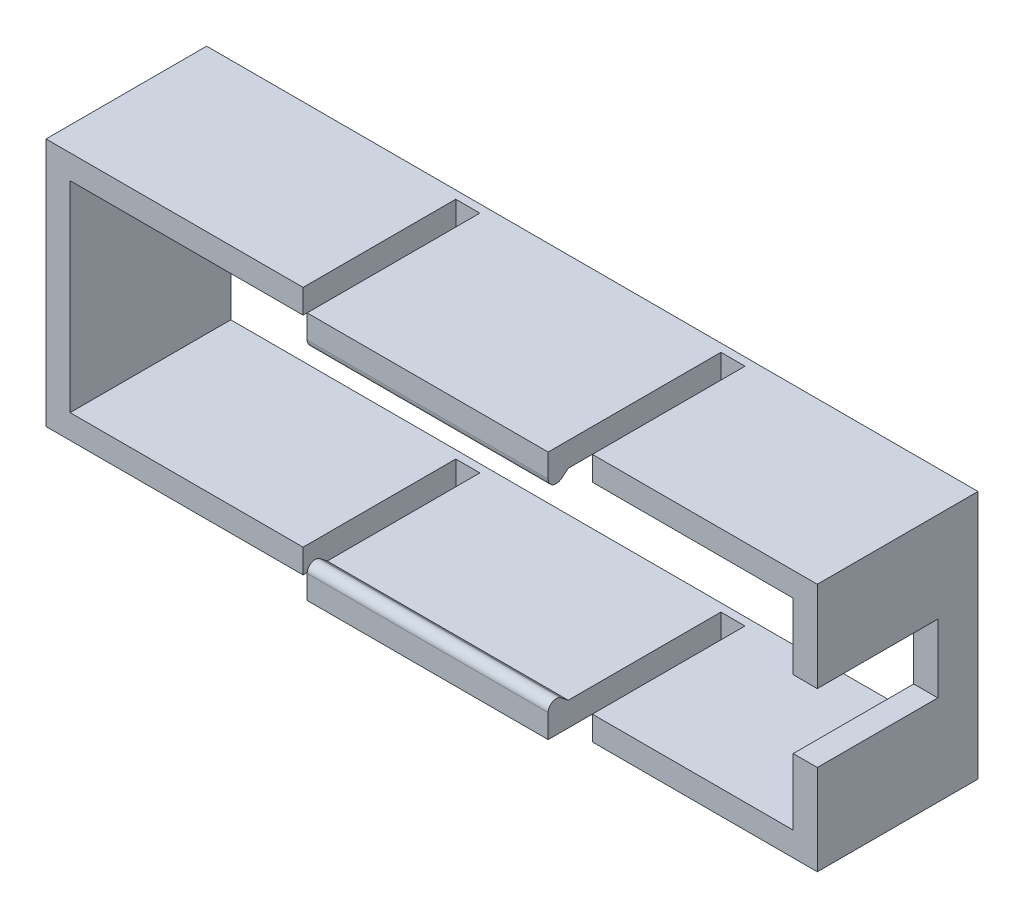
ISO-10303-21;
HEADER;
FILE_DESCRIPTION(('STEP AP214'),'2;1');
FILE_NAME('part.step','',(''),(''),'','','');
FILE_SCHEMA(('AUTOMOTIVE_DESIGN { 1 0 10303 214 1 1 1 1 }'));
ENDSEC;
DATA;
#1=APPLICATION_CONTEXT('core data for automotive mechanical design processes');
#2=APPLICATION_PROTOCOL_DEFINITION('international standard','automotive_design',2000,#1);
#3=PRODUCT_CONTEXT('',#1,'mechanical');
#4=PRODUCT('Part','Part','',(#3));
#5=PRODUCT_RELATED_PRODUCT_CATEGORY('part','',(#4));
#6=PRODUCT_DEFINITION_FORMATION('','',#4);
#7=PRODUCT_DEFINITION_CONTEXT('part definition',#1,'design');
#8=PRODUCT_DEFINITION('design','',#6,#7);
#9=PRODUCT_DEFINITION_SHAPE('','',#8);
#10=(LENGTH_UNIT() NAMED_UNIT(*) SI_UNIT(.MILLI.,.METRE.));
#11=(NAMED_UNIT(*) PLANE_ANGLE_UNIT() SI_UNIT($,.RADIAN.));
#12=(NAMED_UNIT(*) SI_UNIT($,.STERADIAN.) SOLID_ANGLE_UNIT());
#13=UNCERTAINTY_MEASURE_WITH_UNIT(LENGTH_MEASURE(1.E-05),#10,'distance_accuracy_value','');
#14=(GEOMETRIC_REPRESENTATION_CONTEXT(3) GLOBAL_UNCERTAINTY_ASSIGNED_CONTEXT((#13)) GLOBAL_UNIT_ASSIGNED_CONTEXT((#10,
#11,#12)) REPRESENTATION_CONTEXT('',''));
#15=CARTESIAN_POINT('',(0.,0.,0.));
#16=DIRECTION('',(0.,0.,1.));
#17=DIRECTION('',(1.,0.,0.));
#18=AXIS2_PLACEMENT_3D('',#15,#16,#17);
#19=CARTESIAN_POINT('',(0.,0.,20.));
#20=DIRECTION('',(0.,0.,1.));
#21=DIRECTION('',(1.,0.,0.));
#22=AXIS2_PLACEMENT_3D('',#19,#20,#21);
#23=PLANE('',#22);
#24=DIRECTION('',(0.,-1.,0.));
#25=VECTOR('',#24,1.);
#26=CARTESIAN_POINT('',(-16.,36.1234617712572,20.));
#27=LINE('',#26,#25);
#28=CARTESIAN_POINT('',(-16.,15.5,20.));
#29=VERTEX_POINT('',#28);
#30=CARTESIAN_POINT('',(-16.,12.5,20.));
#31=VERTEX_POINT('',#30);
#32=EDGE_CURVE('E336',#29,#31,#27,.T.);
#33=ORIENTED_EDGE('',*,*,#32,.F.);
#34=DIRECTION('',(-1.,0.,0.));
#35=VECTOR('',#34,1.);
#36=CARTESIAN_POINT('',(0.,15.5,20.));
#37=LINE('',#36,#35);
#38=CARTESIAN_POINT('',(-48.,15.5,20.));
#39=VERTEX_POINT('',#38);
#40=EDGE_CURVE('E495',#29,#39,#37,.T.);
#41=ORIENTED_EDGE('',*,*,#40,.T.);
#42=DIRECTION('',(0.,-1.,0.));
#43=VECTOR('',#42,1.);
#44=CARTESIAN_POINT('',(-48.,0.,20.));
#45=LINE('',#44,#43);
#46=CARTESIAN_POINT('',(-48.,-15.5,20.));
#47=VERTEX_POINT('',#46);
#48=EDGE_CURVE('E501',#39,#47,#45,.T.);
#49=ORIENTED_EDGE('',*,*,#48,.T.);
#50=DIRECTION('',(1.,0.,0.));
#51=VECTOR('',#50,1.);
#52=CARTESIAN_POINT('',(0.,-15.5,20.));
#53=LINE('',#52,#51);
#54=CARTESIAN_POINT('',(-16.,-15.5,20.));
#55=VERTEX_POINT('',#54);
#56=EDGE_CURVE('E505',#47,#55,#53,.T.);
#57=ORIENTED_EDGE('',*,*,#56,.T.);
#58=CARTESIAN_POINT('',(-16.,-12.5,20.));
#59=VERTEX_POINT('',#58);
#60=EDGE_CURVE('E342',#59,#55,#27,.T.);
#61=ORIENTED_EDGE('',*,*,#60,.F.);
#62=DIRECTION('',(1.,0.,0.));
#63=VECTOR('',#62,1.);
#64=CARTESIAN_POINT('',(-45.,-12.5,20.));
#65=LINE('',#64,#63);
#66=CARTESIAN_POINT('',(-45.,-12.5,20.));
#67=VERTEX_POINT('',#66);
#68=EDGE_CURVE('E456',#67,#59,#65,.T.);
#69=ORIENTED_EDGE('',*,*,#68,.F.);
#70=DIRECTION('',(0.,-1.,0.));
#71=VECTOR('',#70,1.);
#72=CARTESIAN_POINT('',(-45.,-12.5,20.));
#73=LINE('',#72,#71);
#74=CARTESIAN_POINT('',(-45.,12.5,20.));
#75=VERTEX_POINT('',#74);
#76=EDGE_CURVE('E450',#75,#67,#73,.T.);
#77=ORIENTED_EDGE('',*,*,#76,.F.);
#78=DIRECTION('',(-1.,0.,0.));
#79=VECTOR('',#78,1.);
#80=CARTESIAN_POINT('',(-45.,12.5,20.));
#81=LINE('',#80,#79);
#82=EDGE_CURVE('E444',#31,#75,#81,.T.);
#83=ORIENTED_EDGE('',*,*,#82,.F.);
#84=EDGE_LOOP('',(#33,#41,#49,#57,#61,#69,#77,#83));
#85=FACE_BOUND('',#84,.T.);
#86=ADVANCED_FACE('F65',(#85),#23,.T.);
#87=DIRECTION('',(0.,1.,0.));
#88=VECTOR('',#87,1.);
#89=CARTESIAN_POINT('',(20.,-29.0869382260208,20.));
#90=LINE('',#89,#88);
#91=CARTESIAN_POINT('',(20.,-15.5,20.));
#92=VERTEX_POINT('',#91);
#93=CARTESIAN_POINT('',(20.,-12.5,20.));
#94=VERTEX_POINT('',#93);
#95=EDGE_CURVE('E351',#92,#94,#90,.T.);
#96=ORIENTED_EDGE('',*,*,#95,.F.);
#97=CARTESIAN_POINT('',(48.,-15.5,20.));
#98=VERTEX_POINT('',#97);
#99=EDGE_CURVE('E504',#92,#98,#53,.T.);
#100=ORIENTED_EDGE('',*,*,#99,.T.);
#101=DIRECTION('',(0.,1.,0.));
#102=VECTOR('',#101,1.);
#103=CARTESIAN_POINT('',(48.,0.,20.));
#104=LINE('',#103,#102);
#105=CARTESIAN_POINT('',(48.,-4.25,20.));
#106=VERTEX_POINT('',#105);
#107=EDGE_CURVE('E491',#98,#106,#104,.T.);
#108=ORIENTED_EDGE('',*,*,#107,.T.);
#109=DIRECTION('',(1.,0.,0.));
#110=VECTOR('',#109,1.);
#111=CARTESIAN_POINT('',(23.5129949706792,-4.25,20.));
#112=LINE('',#111,#110);
#113=CARTESIAN_POINT('',(45.,-4.25,20.));
#114=VERTEX_POINT('',#113);
#115=EDGE_CURVE('E419',#114,#106,#112,.T.);
#116=ORIENTED_EDGE('',*,*,#115,.F.);
#117=DIRECTION('',(0.,1.,0.));
#118=VECTOR('',#117,1.);
#119=CARTESIAN_POINT('',(45.,-12.5,20.));
#120=LINE('',#119,#118);
#121=CARTESIAN_POINT('',(45.,-12.5,20.));
#122=VERTEX_POINT('',#121);
#123=EDGE_CURVE('E440',#122,#114,#120,.T.);
#124=ORIENTED_EDGE('',*,*,#123,.F.);
#125=EDGE_CURVE('E455',#94,#122,#65,.T.);
#126=ORIENTED_EDGE('',*,*,#125,.F.);
#127=EDGE_LOOP('',(#96,#100,#108,#116,#124,#126));
#128=FACE_BOUND('',#127,.T.);
#129=ADVANCED_FACE('F615',(#128),#23,.T.);
#130=CARTESIAN_POINT('',(20.,12.5,20.));
#131=VERTEX_POINT('',#130);
#132=CARTESIAN_POINT('',(20.,15.5,20.));
#133=VERTEX_POINT('',#132);
#134=EDGE_CURVE('E330',#131,#133,#90,.T.);
#135=ORIENTED_EDGE('',*,*,#134,.F.);
#136=CARTESIAN_POINT('',(45.,12.5,20.));
#137=VERTEX_POINT('',#136);
#138=EDGE_CURVE('E446',#137,#131,#81,.T.);
#139=ORIENTED_EDGE('',*,*,#138,.F.);
#140=CARTESIAN_POINT('',(45.,4.25,20.));
#141=VERTEX_POINT('',#140);
#142=EDGE_CURVE('E445',#141,#137,#120,.T.);
#143=ORIENTED_EDGE('',*,*,#142,.F.);
#144=DIRECTION('',(-1.,0.,0.));
#145=VECTOR('',#144,1.);
#146=CARTESIAN_POINT('',(23.5129949706792,4.25,20.));
#147=LINE('',#146,#145);
#148=CARTESIAN_POINT('',(48.,4.25,20.));
#149=VERTEX_POINT('',#148);
#150=EDGE_CURVE('E414',#149,#141,#147,.T.);
#151=ORIENTED_EDGE('',*,*,#150,.F.);
#152=CARTESIAN_POINT('',(48.,15.5,20.));
#153=VERTEX_POINT('',#152);
#154=EDGE_CURVE('E496',#149,#153,#104,.T.);
#155=ORIENTED_EDGE('',*,*,#154,.T.);
#156=EDGE_CURVE('E497',#153,#133,#37,.T.);
#157=ORIENTED_EDGE('',*,*,#156,.T.);
#158=EDGE_LOOP('',(#135,#139,#143,#151,#155,#157));
#159=FACE_BOUND('',#158,.T.);
#160=ADVANCED_FACE('F653',(#159),#23,.T.);
#161=CARTESIAN_POINT('',(0.,0.,0.));
#162=DIRECTION('',(0.,0.,1.));
#163=DIRECTION('',(1.,0.,0.));
#164=AXIS2_PLACEMENT_3D('',#161,#162,#163);
#165=PLANE('',#164);
#166=DIRECTION('',(0.,1.,0.));
#167=VECTOR('',#166,1.);
#168=CARTESIAN_POINT('',(48.,0.,0.));
#169=LINE('',#168,#167);
#170=CARTESIAN_POINT('',(48.,-15.5,0.));
#171=VERTEX_POINT('',#170);
#172=CARTESIAN_POINT('',(48.,15.5,0.));
#173=VERTEX_POINT('',#172);
#174=EDGE_CURVE('E490',#171,#173,#169,.T.);
#175=ORIENTED_EDGE('',*,*,#174,.F.);
#176=DIRECTION('',(1.,0.,0.));
#177=VECTOR('',#176,1.);
#178=CARTESIAN_POINT('',(0.,-15.5,0.));
#179=LINE('',#178,#177);
#180=CARTESIAN_POINT('',(-48.,-15.5,0.));
#181=VERTEX_POINT('',#180);
#182=EDGE_CURVE('E519',#181,#171,#179,.T.);
#183=ORIENTED_EDGE('',*,*,#182,.F.);
#184=DIRECTION('',(0.,-1.,0.));
#185=VECTOR('',#184,1.);
#186=CARTESIAN_POINT('',(-48.,0.,0.));
#187=LINE('',#186,#185);
#188=CARTESIAN_POINT('',(-48.,15.5,0.));
#189=VERTEX_POINT('',#188);
#190=EDGE_CURVE('E516',#189,#181,#187,.T.);
#191=ORIENTED_EDGE('',*,*,#190,.F.);
#192=DIRECTION('',(-1.,0.,0.));
#193=VECTOR('',#192,1.);
#194=CARTESIAN_POINT('',(0.,15.5,0.));
#195=LINE('',#194,#193);
#196=EDGE_CURVE('E513',#173,#189,#195,.T.);
#197=ORIENTED_EDGE('',*,*,#196,.F.);
#198=EDGE_LOOP('',(#175,#183,#191,#197));
#199=FACE_BOUND('',#198,.T.);
#200=DIRECTION('',(0.,1.,0.));
#201=VECTOR('',#200,1.);
#202=CARTESIAN_POINT('',(45.,-12.5,0.));
#203=LINE('',#202,#201);
#204=CARTESIAN_POINT('',(45.,-12.5,0.));
#205=VERTEX_POINT('',#204);
#206=CARTESIAN_POINT('',(45.,12.5,0.));
#207=VERTEX_POINT('',#206);
#208=EDGE_CURVE('E439',#205,#207,#203,.T.);
#209=ORIENTED_EDGE('',*,*,#208,.T.);
#210=DIRECTION('',(-1.,0.,0.));
#211=VECTOR('',#210,1.);
#212=CARTESIAN_POINT('',(-45.,12.5,0.));
#213=LINE('',#212,#211);
#214=CARTESIAN_POINT('',(-45.,12.5,0.));
#215=VERTEX_POINT('',#214);
#216=EDGE_CURVE('E465',#207,#215,#213,.T.);
#217=ORIENTED_EDGE('',*,*,#216,.T.);
#218=DIRECTION('',(0.,-1.,0.));
#219=VECTOR('',#218,1.);
#220=CARTESIAN_POINT('',(-45.,-12.5,0.));
#221=LINE('',#220,#219);
#222=CARTESIAN_POINT('',(-45.,-12.5,0.));
#223=VERTEX_POINT('',#222);
#224=EDGE_CURVE('E469',#215,#223,#221,.T.);
#225=ORIENTED_EDGE('',*,*,#224,.T.);
#226=DIRECTION('',(1.,0.,0.));
#227=VECTOR('',#226,1.);
#228=CARTESIAN_POINT('',(-45.,-12.5,0.));
#229=LINE('',#228,#227);
#230=EDGE_CURVE('E473',#223,#205,#229,.T.);
#231=ORIENTED_EDGE('',*,*,#230,.T.);
#232=EDGE_LOOP('',(#209,#217,#225,#231));
#233=FACE_BOUND('',#232,.T.);
#234=ADVANCED_FACE('F623',(#199,#233),#165,.F.);
#235=CARTESIAN_POINT('',(48.,0.,20.));
#236=DIRECTION('',(-1.,0.,0.));
#237=DIRECTION('',(0.,0.,1.));
#238=AXIS2_PLACEMENT_3D('',#235,#236,#237);
#239=PLANE('',#238);
#240=DIRECTION('',(0.,-1.,0.));
#241=VECTOR('',#240,1.);
#242=CARTESIAN_POINT('',(48.,0.,5.));
#243=LINE('',#242,#241);
#244=CARTESIAN_POINT('',(48.,4.25,5.));
#245=VERTEX_POINT('',#244);
#246=CARTESIAN_POINT('',(48.,-4.25,5.));
#247=VERTEX_POINT('',#246);
#248=EDGE_CURVE('E423',#245,#247,#243,.T.);
#249=ORIENTED_EDGE('',*,*,#248,.T.);
#250=DIRECTION('',(0.,0.,1.));
#251=VECTOR('',#250,1.);
#252=CARTESIAN_POINT('',(48.,-4.25,20.));
#253=LINE('',#252,#251);
#254=EDGE_CURVE('E435',#247,#106,#253,.T.);
#255=ORIENTED_EDGE('',*,*,#254,.T.);
#256=ORIENTED_EDGE('',*,*,#107,.F.);
#257=DIRECTION('',(0.,0.,-1.));
#258=VECTOR('',#257,1.);
#259=CARTESIAN_POINT('',(48.,-15.5,20.));
#260=LINE('',#259,#258);
#261=EDGE_CURVE('E509',#98,#171,#260,.T.);
#262=ORIENTED_EDGE('',*,*,#261,.T.);
#263=ORIENTED_EDGE('',*,*,#174,.T.);
#264=DIRECTION('',(0.,0.,-1.));
#265=VECTOR('',#264,1.);
#266=CARTESIAN_POINT('',(48.,15.5,20.));
#267=LINE('',#266,#265);
#268=EDGE_CURVE('E533',#153,#173,#267,.T.);
#269=ORIENTED_EDGE('',*,*,#268,.F.);
#270=ORIENTED_EDGE('',*,*,#154,.F.);
#271=DIRECTION('',(0.,0.,-1.));
#272=VECTOR('',#271,1.);
#273=CARTESIAN_POINT('',(48.,4.25,20.));
#274=LINE('',#273,#272);
#275=EDGE_CURVE('E431',#149,#245,#274,.T.);
#276=ORIENTED_EDGE('',*,*,#275,.T.);
#277=EDGE_LOOP('',(#249,#255,#256,#262,#263,#269,#270,#276));
#278=FACE_BOUND('',#277,.T.);
#279=ADVANCED_FACE('F664',(#278),#239,.F.);
#280=CARTESIAN_POINT('',(0.,15.5,20.));
#281=DIRECTION('',(0.,-1.,0.));
#282=DIRECTION('',(0.,0.,-1.));
#283=AXIS2_PLACEMENT_3D('',#280,#281,#282);
#284=PLANE('',#283);
#285=ORIENTED_EDGE('',*,*,#40,.F.);
#286=DIRECTION('',(0.,0.,-1.));
#287=VECTOR('',#286,1.);
#288=CARTESIAN_POINT('',(-16.,15.5,20.));
#289=LINE('',#288,#287);
#290=CARTESIAN_POINT('',(-16.,15.5,1.));
#291=VERTEX_POINT('',#290);
#292=EDGE_CURVE('E410',#29,#291,#289,.T.);
#293=ORIENTED_EDGE('',*,*,#292,.T.);
#294=DIRECTION('',(1.,0.,0.));
#295=VECTOR('',#294,1.);
#296=CARTESIAN_POINT('',(0.,15.5,1.));
#297=LINE('',#296,#295);
#298=CARTESIAN_POINT('',(-13.,15.5,1.));
#299=VERTEX_POINT('',#298);
#300=EDGE_CURVE('E388',#291,#299,#297,.T.);
#301=ORIENTED_EDGE('',*,*,#300,.T.);
#302=DIRECTION('',(0.,0.,-1.));
#303=VECTOR('',#302,1.);
#304=CARTESIAN_POINT('',(-13.,15.5,20.));
#305=LINE('',#304,#303);
#306=CARTESIAN_POINT('',(-13.,15.5,22.5));
#307=VERTEX_POINT('',#306);
#308=EDGE_CURVE('E399',#307,#299,#305,.T.);
#309=ORIENTED_EDGE('',*,*,#308,.F.);
#310=DIRECTION('',(-1.,0.,0.));
#311=VECTOR('',#310,1.);
#312=CARTESIAN_POINT('',(22.5901699437495,15.5,22.5));
#313=LINE('',#312,#311);
#314=CARTESIAN_POINT('',(17.,15.5,22.5));
#315=VERTEX_POINT('',#314);
#316=EDGE_CURVE('E326',#315,#307,#313,.T.);
#317=ORIENTED_EDGE('',*,*,#316,.F.);
#318=DIRECTION('',(0.,0.,1.));
#319=VECTOR('',#318,1.);
#320=CARTESIAN_POINT('',(17.,15.5,20.));
#321=LINE('',#320,#319);
#322=CARTESIAN_POINT('',(17.,15.5,1.));
#323=VERTEX_POINT('',#322);
#324=EDGE_CURVE('E299',#323,#315,#321,.T.);
#325=ORIENTED_EDGE('',*,*,#324,.F.);
#326=DIRECTION('',(1.,0.,0.));
#327=VECTOR('',#326,1.);
#328=CARTESIAN_POINT('',(0.,15.5,1.));
#329=LINE('',#328,#327);
#330=CARTESIAN_POINT('',(20.,15.5,1.));
#331=VERTEX_POINT('',#330);
#332=EDGE_CURVE('E363',#323,#331,#329,.T.);
#333=ORIENTED_EDGE('',*,*,#332,.T.);
#334=DIRECTION('',(0.,0.,1.));
#335=VECTOR('',#334,1.);
#336=CARTESIAN_POINT('',(20.,15.5,20.));
#337=LINE('',#336,#335);
#338=EDGE_CURVE('E378',#331,#133,#337,.T.);
#339=ORIENTED_EDGE('',*,*,#338,.T.);
#340=ORIENTED_EDGE('',*,*,#156,.F.);
#341=ORIENTED_EDGE('',*,*,#268,.T.);
#342=ORIENTED_EDGE('',*,*,#196,.T.);
#343=DIRECTION('',(0.,0.,-1.));
#344=VECTOR('',#343,1.);
#345=CARTESIAN_POINT('',(-48.,15.5,20.));
#346=LINE('',#345,#344);
#347=EDGE_CURVE('E529',#39,#189,#346,.T.);
#348=ORIENTED_EDGE('',*,*,#347,.F.);
#349=EDGE_LOOP('',(#285,#293,#301,#309,#317,#325,#333,#339,#340,#341,#342,#348));
#350=FACE_BOUND('',#349,.T.);
#351=ADVANCED_FACE('F686',(#350),#284,.F.);
#352=CARTESIAN_POINT('',(-48.,0.,20.));
#353=DIRECTION('',(1.,0.,0.));
#354=DIRECTION('',(0.,0.,-1.));
#355=AXIS2_PLACEMENT_3D('',#352,#353,#354);
#356=PLANE('',#355);
#357=ORIENTED_EDGE('',*,*,#190,.T.);
#358=DIRECTION('',(0.,0.,-1.));
#359=VECTOR('',#358,1.);
#360=CARTESIAN_POINT('',(-48.,-15.5,20.));
#361=LINE('',#360,#359);
#362=EDGE_CURVE('E525',#47,#181,#361,.T.);
#363=ORIENTED_EDGE('',*,*,#362,.F.);
#364=ORIENTED_EDGE('',*,*,#48,.F.);
#365=ORIENTED_EDGE('',*,*,#347,.T.);
#366=EDGE_LOOP('',(#357,#363,#364,#365));
#367=FACE_BOUND('',#366,.T.);
#368=ADVANCED_FACE('F719',(#367),#356,.F.);
#369=CARTESIAN_POINT('',(0.,-15.5,20.));
#370=DIRECTION('',(0.,1.,0.));
#371=DIRECTION('',(0.,0.,1.));
#372=AXIS2_PLACEMENT_3D('',#369,#370,#371);
#373=PLANE('',#372);
#374=DIRECTION('',(-1.,0.,0.));
#375=VECTOR('',#374,1.);
#376=CARTESIAN_POINT('',(0.,-15.5,1.));
#377=LINE('',#376,#375);
#378=CARTESIAN_POINT('',(-13.,-15.5,1.));
#379=VERTEX_POINT('',#378);
#380=CARTESIAN_POINT('',(-16.,-15.5,1.));
#381=VERTEX_POINT('',#380);
#382=EDGE_CURVE('E385',#379,#381,#377,.T.);
#383=ORIENTED_EDGE('',*,*,#382,.T.);
#384=DIRECTION('',(0.,0.,1.));
#385=VECTOR('',#384,1.);
#386=CARTESIAN_POINT('',(-16.,-15.5,20.));
#387=LINE('',#386,#385);
#388=EDGE_CURVE('E406',#381,#55,#387,.T.);
#389=ORIENTED_EDGE('',*,*,#388,.T.);
#390=ORIENTED_EDGE('',*,*,#56,.F.);
#391=ORIENTED_EDGE('',*,*,#362,.T.);
#392=ORIENTED_EDGE('',*,*,#182,.T.);
#393=ORIENTED_EDGE('',*,*,#261,.F.);
#394=ORIENTED_EDGE('',*,*,#99,.F.);
#395=DIRECTION('',(0.,0.,-1.));
#396=VECTOR('',#395,1.);
#397=CARTESIAN_POINT('',(20.,-15.5,20.));
#398=LINE('',#397,#396);
#399=CARTESIAN_POINT('',(20.,-15.5,1.));
#400=VERTEX_POINT('',#399);
#401=EDGE_CURVE('E375',#92,#400,#398,.T.);
#402=ORIENTED_EDGE('',*,*,#401,.T.);
#403=DIRECTION('',(-1.,0.,0.));
#404=VECTOR('',#403,1.);
#405=CARTESIAN_POINT('',(0.,-15.5,1.));
#406=LINE('',#405,#404);
#407=CARTESIAN_POINT('',(17.,-15.5,1.));
#408=VERTEX_POINT('',#407);
#409=EDGE_CURVE('E297',#400,#408,#406,.T.);
#410=ORIENTED_EDGE('',*,*,#409,.T.);
#411=DIRECTION('',(0.,0.,-1.));
#412=VECTOR('',#411,1.);
#413=CARTESIAN_POINT('',(17.,-15.5,20.));
#414=LINE('',#413,#412);
#415=CARTESIAN_POINT('',(17.,-15.5,22.5));
#416=VERTEX_POINT('',#415);
#417=EDGE_CURVE('E278',#416,#408,#414,.T.);
#418=ORIENTED_EDGE('',*,*,#417,.F.);
#419=DIRECTION('',(-1.,0.,0.));
#420=VECTOR('',#419,1.);
#421=CARTESIAN_POINT('',(22.5901699437495,-15.5,22.5));
#422=LINE('',#421,#420);
#423=CARTESIAN_POINT('',(-13.,-15.5,22.5));
#424=VERTEX_POINT('',#423);
#425=EDGE_CURVE('E295',#416,#424,#422,.T.);
#426=ORIENTED_EDGE('',*,*,#425,.T.);
#427=DIRECTION('',(0.,0.,1.));
#428=VECTOR('',#427,1.);
#429=CARTESIAN_POINT('',(-13.,-15.5,20.));
#430=LINE('',#429,#428);
#431=EDGE_CURVE('E396',#379,#424,#430,.T.);
#432=ORIENTED_EDGE('',*,*,#431,.F.);
#433=EDGE_LOOP('',(#383,#389,#390,#391,#392,#393,#394,#402,#410,#418,#426,#432));
#434=FACE_BOUND('',#433,.T.);
#435=ADVANCED_FACE('F293',(#434),#373,.F.);
#436=CARTESIAN_POINT('',(45.,-12.5,20.));
#437=DIRECTION('',(-1.,0.,0.));
#438=DIRECTION('',(0.,0.,1.));
#439=AXIS2_PLACEMENT_3D('',#436,#437,#438);
#440=PLANE('',#439);
#441=DIRECTION('',(0.,0.,1.));
#442=VECTOR('',#441,1.);
#443=CARTESIAN_POINT('',(45.,-4.25,20.));
#444=LINE('',#443,#442);
#445=CARTESIAN_POINT('',(45.,-4.25,5.));
#446=VERTEX_POINT('',#445);
#447=EDGE_CURVE('E544',#446,#114,#444,.T.);
#448=ORIENTED_EDGE('',*,*,#447,.F.);
#449=DIRECTION('',(0.,-1.,0.));
#450=VECTOR('',#449,1.);
#451=CARTESIAN_POINT('',(45.,-12.5,5.));
#452=LINE('',#451,#450);
#453=CARTESIAN_POINT('',(45.,4.25,5.));
#454=VERTEX_POINT('',#453);
#455=EDGE_CURVE('E537',#454,#446,#452,.T.);
#456=ORIENTED_EDGE('',*,*,#455,.F.);
#457=DIRECTION('',(0.,0.,-1.));
#458=VECTOR('',#457,1.);
#459=CARTESIAN_POINT('',(45.,4.25,20.));
#460=LINE('',#459,#458);
#461=EDGE_CURVE('E540',#141,#454,#460,.T.);
#462=ORIENTED_EDGE('',*,*,#461,.F.);
#463=ORIENTED_EDGE('',*,*,#142,.T.);
#464=DIRECTION('',(0.,0.,-1.));
#465=VECTOR('',#464,1.);
#466=CARTESIAN_POINT('',(45.,12.5,20.));
#467=LINE('',#466,#465);
#468=EDGE_CURVE('E486',#137,#207,#467,.T.);
#469=ORIENTED_EDGE('',*,*,#468,.T.);
#470=ORIENTED_EDGE('',*,*,#208,.F.);
#471=DIRECTION('',(0.,0.,-1.));
#472=VECTOR('',#471,1.);
#473=CARTESIAN_POINT('',(45.,-12.5,20.));
#474=LINE('',#473,#472);
#475=EDGE_CURVE('E460',#122,#205,#474,.T.);
#476=ORIENTED_EDGE('',*,*,#475,.F.);
#477=ORIENTED_EDGE('',*,*,#123,.T.);
#478=EDGE_LOOP('',(#448,#456,#462,#463,#469,#470,#476,#477));
#479=FACE_BOUND('',#478,.T.);
#480=ADVANCED_FACE('F619',(#479),#440,.T.);
#481=CARTESIAN_POINT('',(-45.,12.5,20.));
#482=DIRECTION('',(0.,-1.,0.));
#483=DIRECTION('',(0.,0.,-1.));
#484=AXIS2_PLACEMENT_3D('',#481,#482,#483);
#485=PLANE('',#484);
#486=DIRECTION('',(0.,0.,-1.));
#487=VECTOR('',#486,1.);
#488=CARTESIAN_POINT('',(-16.,12.5,20.));
#489=LINE('',#488,#487);
#490=CARTESIAN_POINT('',(-16.,12.5,1.));
#491=VERTEX_POINT('',#490);
#492=EDGE_CURVE('E402',#31,#491,#489,.T.);
#493=ORIENTED_EDGE('',*,*,#492,.F.);
#494=ORIENTED_EDGE('',*,*,#82,.T.);
#495=DIRECTION('',(0.,0.,-1.));
#496=VECTOR('',#495,1.);
#497=CARTESIAN_POINT('',(-45.,12.5,20.));
#498=LINE('',#497,#496);
#499=EDGE_CURVE('E483',#75,#215,#498,.T.);
#500=ORIENTED_EDGE('',*,*,#499,.T.);
#501=ORIENTED_EDGE('',*,*,#216,.F.);
#502=ORIENTED_EDGE('',*,*,#468,.F.);
#503=ORIENTED_EDGE('',*,*,#138,.T.);
#504=DIRECTION('',(0.,0.,1.));
#505=VECTOR('',#504,1.);
#506=CARTESIAN_POINT('',(20.,12.5,20.));
#507=LINE('',#506,#505);
#508=CARTESIAN_POINT('',(20.,12.5,1.));
#509=VERTEX_POINT('',#508);
#510=EDGE_CURVE('E372',#509,#131,#507,.T.);
#511=ORIENTED_EDGE('',*,*,#510,.F.);
#512=DIRECTION('',(1.,0.,0.));
#513=VECTOR('',#512,1.);
#514=CARTESIAN_POINT('',(-45.,12.5,1.));
#515=LINE('',#514,#513);
#516=CARTESIAN_POINT('',(17.,12.5,1.));
#517=VERTEX_POINT('',#516);
#518=EDGE_CURVE('E358',#517,#509,#515,.T.);
#519=ORIENTED_EDGE('',*,*,#518,.F.);
#520=DIRECTION('',(0.,0.,1.));
#521=VECTOR('',#520,1.);
#522=CARTESIAN_POINT('',(17.,12.5,20.));
#523=LINE('',#522,#521);
#524=CARTESIAN_POINT('',(17.,12.5,20.));
#525=VERTEX_POINT('',#524);
#526=EDGE_CURVE('E300',#517,#525,#523,.T.);
#527=ORIENTED_EDGE('',*,*,#526,.T.);
#528=CARTESIAN_POINT('',(-13.,12.5,20.));
#529=VERTEX_POINT('',#528);
#530=EDGE_CURVE('E451',#525,#529,#81,.T.);
#531=ORIENTED_EDGE('',*,*,#530,.T.);
#532=DIRECTION('',(0.,0.,-1.));
#533=VECTOR('',#532,1.);
#534=CARTESIAN_POINT('',(-13.,12.5,20.));
#535=LINE('',#534,#533);
#536=CARTESIAN_POINT('',(-13.,12.5,1.));
#537=VERTEX_POINT('',#536);
#538=EDGE_CURVE('E392',#529,#537,#535,.T.);
#539=ORIENTED_EDGE('',*,*,#538,.T.);
#540=DIRECTION('',(1.,0.,0.));
#541=VECTOR('',#540,1.);
#542=CARTESIAN_POINT('',(-45.,12.5,1.));
#543=LINE('',#542,#541);
#544=EDGE_CURVE('E382',#491,#537,#543,.T.);
#545=ORIENTED_EDGE('',*,*,#544,.F.);
#546=EDGE_LOOP('',(#493,#494,#500,#501,#502,#503,#511,#519,#527,#531,#539,#545));
#547=FACE_BOUND('',#546,.T.);
#548=ADVANCED_FACE('F675',(#547),#485,.T.);
#549=CARTESIAN_POINT('',(-45.,-12.5,20.));
#550=DIRECTION('',(1.,0.,0.));
#551=DIRECTION('',(0.,0.,-1.));
#552=AXIS2_PLACEMENT_3D('',#549,#550,#551);
#553=PLANE('',#552);
#554=ORIENTED_EDGE('',*,*,#224,.F.);
#555=ORIENTED_EDGE('',*,*,#499,.F.);
#556=ORIENTED_EDGE('',*,*,#76,.T.);
#557=DIRECTION('',(0.,0.,-1.));
#558=VECTOR('',#557,1.);
#559=CARTESIAN_POINT('',(-45.,-12.5,20.));
#560=LINE('',#559,#558);
#561=EDGE_CURVE('E480',#67,#223,#560,.T.);
#562=ORIENTED_EDGE('',*,*,#561,.T.);
#563=EDGE_LOOP('',(#554,#555,#556,#562));
#564=FACE_BOUND('',#563,.T.);
#565=ADVANCED_FACE('F627',(#564),#553,.T.);
#566=CARTESIAN_POINT('',(-45.,-12.5,20.));
#567=DIRECTION('',(0.,1.,0.));
#568=DIRECTION('',(0.,0.,1.));
#569=AXIS2_PLACEMENT_3D('',#566,#567,#568);
#570=PLANE('',#569);
#571=DIRECTION('',(0.,0.,1.));
#572=VECTOR('',#571,1.);
#573=CARTESIAN_POINT('',(-16.,-12.5,20.));
#574=LINE('',#573,#572);
#575=CARTESIAN_POINT('',(-16.,-12.5,1.));
#576=VERTEX_POINT('',#575);
#577=EDGE_CURVE('E564',#576,#59,#574,.T.);
#578=ORIENTED_EDGE('',*,*,#577,.F.);
#579=DIRECTION('',(-1.,0.,0.));
#580=VECTOR('',#579,1.);
#581=CARTESIAN_POINT('',(-45.,-12.5,1.));
#582=LINE('',#581,#580);
#583=CARTESIAN_POINT('',(-13.,-12.5,1.));
#584=VERTEX_POINT('',#583);
#585=EDGE_CURVE('E558',#584,#576,#582,.T.);
#586=ORIENTED_EDGE('',*,*,#585,.F.);
#587=DIRECTION('',(0.,0.,1.));
#588=VECTOR('',#587,1.);
#589=CARTESIAN_POINT('',(-13.,-12.5,20.));
#590=LINE('',#589,#588);
#591=CARTESIAN_POINT('',(-13.,-12.5,20.));
#592=VERTEX_POINT('',#591);
#593=EDGE_CURVE('E561',#584,#592,#590,.T.);
#594=ORIENTED_EDGE('',*,*,#593,.T.);
#595=CARTESIAN_POINT('',(17.,-12.5,20.));
#596=VERTEX_POINT('',#595);
#597=EDGE_CURVE('E461',#592,#596,#65,.T.);
#598=ORIENTED_EDGE('',*,*,#597,.T.);
#599=DIRECTION('',(0.,0.,-1.));
#600=VECTOR('',#599,1.);
#601=CARTESIAN_POINT('',(17.,-12.5,20.));
#602=LINE('',#601,#600);
#603=CARTESIAN_POINT('',(17.,-12.5,1.));
#604=VERTEX_POINT('',#603);
#605=EDGE_CURVE('E550',#596,#604,#602,.T.);
#606=ORIENTED_EDGE('',*,*,#605,.T.);
#607=DIRECTION('',(-1.,0.,0.));
#608=VECTOR('',#607,1.);
#609=CARTESIAN_POINT('',(-45.,-12.5,1.));
#610=LINE('',#609,#608);
#611=CARTESIAN_POINT('',(20.,-12.5,1.));
#612=VERTEX_POINT('',#611);
#613=EDGE_CURVE('E547',#612,#604,#610,.T.);
#614=ORIENTED_EDGE('',*,*,#613,.F.);
#615=DIRECTION('',(0.,0.,-1.));
#616=VECTOR('',#615,1.);
#617=CARTESIAN_POINT('',(20.,-12.5,20.));
#618=LINE('',#617,#616);
#619=EDGE_CURVE('E554',#94,#612,#618,.T.);
#620=ORIENTED_EDGE('',*,*,#619,.F.);
#621=ORIENTED_EDGE('',*,*,#125,.T.);
#622=ORIENTED_EDGE('',*,*,#475,.T.);
#623=ORIENTED_EDGE('',*,*,#230,.F.);
#624=ORIENTED_EDGE('',*,*,#561,.F.);
#625=ORIENTED_EDGE('',*,*,#68,.T.);
#626=EDGE_LOOP('',(#578,#586,#594,#598,#606,#614,#620,#621,#622,#623,#624,#625));
#627=FACE_BOUND('',#626,.T.);
#628=ADVANCED_FACE('F612',(#627),#570,.T.);
#629=CARTESIAN_POINT('',(23.5129949706792,-4.25,5.));
#630=DIRECTION('',(0.,-1.,0.));
#631=DIRECTION('',(0.,0.,-1.));
#632=AXIS2_PLACEMENT_3D('',#629,#630,#631);
#633=PLANE('',#632);
#634=DIRECTION('',(1.,0.,0.));
#635=VECTOR('',#634,1.);
#636=CARTESIAN_POINT('',(23.5129949706792,-4.25,5.));
#637=LINE('',#636,#635);
#638=EDGE_CURVE('E418',#446,#247,#637,.T.);
#639=ORIENTED_EDGE('',*,*,#638,.F.);
#640=ORIENTED_EDGE('',*,*,#447,.T.);
#641=ORIENTED_EDGE('',*,*,#115,.T.);
#642=ORIENTED_EDGE('',*,*,#254,.F.);
#643=EDGE_LOOP('',(#639,#640,#641,#642));
#644=FACE_BOUND('',#643,.T.);
#645=ADVANCED_FACE('F725',(#644),#633,.F.);
#646=CARTESIAN_POINT('',(23.5129949706792,4.25,5.));
#647=DIRECTION('',(0.,1.,0.));
#648=DIRECTION('',(0.,0.,1.));
#649=AXIS2_PLACEMENT_3D('',#646,#647,#648);
#650=PLANE('',#649);
#651=ORIENTED_EDGE('',*,*,#150,.T.);
#652=ORIENTED_EDGE('',*,*,#461,.T.);
#653=DIRECTION('',(-1.,0.,0.));
#654=VECTOR('',#653,1.);
#655=CARTESIAN_POINT('',(23.5129949706792,4.25,5.));
#656=LINE('',#655,#654);
#657=EDGE_CURVE('E415',#245,#454,#656,.T.);
#658=ORIENTED_EDGE('',*,*,#657,.F.);
#659=ORIENTED_EDGE('',*,*,#275,.F.);
#660=EDGE_LOOP('',(#651,#652,#658,#659));
#661=FACE_BOUND('',#660,.T.);
#662=ADVANCED_FACE('F729',(#661),#650,.F.);
#663=CARTESIAN_POINT('',(0.,0.,5.));
#664=DIRECTION('',(0.,0.,-1.));
#665=DIRECTION('',(-1.,0.,0.));
#666=AXIS2_PLACEMENT_3D('',#663,#664,#665);
#667=PLANE('',#666);
#668=ORIENTED_EDGE('',*,*,#657,.T.);
#669=ORIENTED_EDGE('',*,*,#455,.T.);
#670=ORIENTED_EDGE('',*,*,#638,.T.);
#671=ORIENTED_EDGE('',*,*,#248,.F.);
#672=EDGE_LOOP('',(#668,#669,#670,#671));
#673=FACE_BOUND('',#672,.T.);
#674=ADVANCED_FACE('F727',(#673),#667,.F.);
#675=CARTESIAN_POINT('',(0.,0.,1.));
#676=DIRECTION('',(0.,0.,-1.));
#677=DIRECTION('',(-1.,0.,0.));
#678=AXIS2_PLACEMENT_3D('',#675,#676,#677);
#679=PLANE('',#678);
#680=DIRECTION('',(0.,1.,0.));
#681=VECTOR('',#680,1.);
#682=CARTESIAN_POINT('',(20.,-29.0869382260208,1.));
#683=LINE('',#682,#681);
#684=EDGE_CURVE('E350',#400,#612,#683,.T.);
#685=ORIENTED_EDGE('',*,*,#684,.T.);
#686=ORIENTED_EDGE('',*,*,#613,.T.);
#687=DIRECTION('',(0.,1.,0.));
#688=VECTOR('',#687,1.);
#689=CARTESIAN_POINT('',(17.,-29.0869382260208,1.));
#690=LINE('',#689,#688);
#691=EDGE_CURVE('E345',#408,#604,#690,.T.);
#692=ORIENTED_EDGE('',*,*,#691,.F.);
#693=ORIENTED_EDGE('',*,*,#409,.F.);
#694=EDGE_LOOP('',(#685,#686,#692,#693));
#695=FACE_BOUND('',#694,.T.);
#696=ADVANCED_FACE('F736',(#695),#679,.F.);
#697=CARTESIAN_POINT('',(17.,-29.0869382260208,1.));
#698=DIRECTION('',(1.,0.,0.));
#699=DIRECTION('',(0.,0.,-1.));
#700=AXIS2_PLACEMENT_3D('',#697,#698,#699);
#701=PLANE('',#700);
#702=DIRECTION('',(0.,0.624695047554424,0.78086880944303));
#703=VECTOR('',#702,1.);
#704=CARTESIAN_POINT('',(17.,-10.5,22.5));
#705=LINE('',#704,#703);
#706=CARTESIAN_POINT('',(17.,-11.7997560380435,20.8753049524456));
#707=VERTEX_POINT('',#706);
#708=EDGE_CURVE('E287',#596,#707,#705,.T.);
#709=ORIENTED_EDGE('',*,*,#708,.T.);
#710=CARTESIAN_POINT('',(17.,-12.5806248474866,21.5));
#711=DIRECTION('',(1.,0.,0.));
#712=DIRECTION('',(0.,0.,-1.));
#713=AXIS2_PLACEMENT_3D('',#710,#711,#712);
#714=CIRCLE('',#713,1.);
#715=CARTESIAN_POINT('',(17.,-12.5806248474866,22.5));
#716=VERTEX_POINT('',#715);
#717=EDGE_CURVE('E12',#707,#716,#714,.T.);
#718=ORIENTED_EDGE('',*,*,#717,.T.);
#719=DIRECTION('',(0.,-1.,0.));
#720=VECTOR('',#719,1.);
#721=CARTESIAN_POINT('',(17.,-15.5,22.5));
#722=LINE('',#721,#720);
#723=EDGE_CURVE('E274',#716,#416,#722,.T.);
#724=ORIENTED_EDGE('',*,*,#723,.T.);
#725=ORIENTED_EDGE('',*,*,#417,.T.);
#726=ORIENTED_EDGE('',*,*,#691,.T.);
#727=ORIENTED_EDGE('',*,*,#605,.F.);
#728=EDGE_LOOP('',(#709,#718,#724,#725,#726,#727));
#729=FACE_BOUND('',#728,.T.);
#730=ADVANCED_FACE('F276',(#729),#701,.T.);
#731=CARTESIAN_POINT('',(20.,-29.0869382260208,1.));
#732=DIRECTION('',(1.,0.,0.));
#733=DIRECTION('',(0.,0.,-1.));
#734=AXIS2_PLACEMENT_3D('',#731,#732,#733);
#735=PLANE('',#734);
#736=ORIENTED_EDGE('',*,*,#95,.T.);
#737=ORIENTED_EDGE('',*,*,#619,.T.);
#738=ORIENTED_EDGE('',*,*,#684,.F.);
#739=ORIENTED_EDGE('',*,*,#401,.F.);
#740=EDGE_LOOP('',(#736,#737,#738,#739));
#741=FACE_BOUND('',#740,.T.);
#742=ADVANCED_FACE('F604',(#741),#735,.F.);
#743=CARTESIAN_POINT('',(0.,0.,1.));
#744=DIRECTION('',(0.,0.,-1.));
#745=DIRECTION('',(-1.,0.,0.));
#746=AXIS2_PLACEMENT_3D('',#743,#744,#745);
#747=PLANE('',#746);
#748=DIRECTION('',(0.,-1.,0.));
#749=VECTOR('',#748,1.);
#750=CARTESIAN_POINT('',(-13.,36.1234617712572,1.));
#751=LINE('',#750,#749);
#752=EDGE_CURVE('E337',#584,#379,#751,.T.);
#753=ORIENTED_EDGE('',*,*,#752,.F.);
#754=ORIENTED_EDGE('',*,*,#585,.T.);
#755=DIRECTION('',(0.,-1.,0.));
#756=VECTOR('',#755,1.);
#757=CARTESIAN_POINT('',(-16.,36.1234617712572,1.));
#758=LINE('',#757,#756);
#759=EDGE_CURVE('E331',#576,#381,#758,.T.);
#760=ORIENTED_EDGE('',*,*,#759,.T.);
#761=ORIENTED_EDGE('',*,*,#382,.F.);
#762=EDGE_LOOP('',(#753,#754,#760,#761));
#763=FACE_BOUND('',#762,.T.);
#764=ADVANCED_FACE('F640',(#763),#747,.F.);
#765=CARTESIAN_POINT('',(-13.,36.1234617712572,1.));
#766=DIRECTION('',(-1.,0.,0.));
#767=DIRECTION('',(0.,-1.,0.));
#768=AXIS2_PLACEMENT_3D('',#765,#766,#767);
#769=PLANE('',#768);
#770=DIRECTION('',(0.,-1.,0.));
#771=VECTOR('',#770,1.);
#772=CARTESIAN_POINT('',(-13.,-15.5,22.5));
#773=LINE('',#772,#771);
#774=CARTESIAN_POINT('',(-13.,-12.5806248474866,22.5));
#775=VERTEX_POINT('',#774);
#776=EDGE_CURVE('E303',#775,#424,#773,.T.);
#777=ORIENTED_EDGE('',*,*,#776,.F.);
#778=CARTESIAN_POINT('',(-13.,-12.5806248474866,21.5));
#779=DIRECTION('',(-1.,0.,0.));
#780=DIRECTION('',(0.,-1.,0.));
#781=AXIS2_PLACEMENT_3D('',#778,#779,#780);
#782=CIRCLE('',#781,1.);
#783=CARTESIAN_POINT('',(-13.,-11.7997560380435,20.8753049524456));
#784=VERTEX_POINT('',#783);
#785=EDGE_CURVE('E88',#775,#784,#782,.T.);
#786=ORIENTED_EDGE('',*,*,#785,.T.);
#787=DIRECTION('',(0.,0.624695047554424,0.78086880944303));
#788=VECTOR('',#787,1.);
#789=CARTESIAN_POINT('',(-13.,-10.5,22.5));
#790=LINE('',#789,#788);
#791=EDGE_CURVE('E310',#592,#784,#790,.T.);
#792=ORIENTED_EDGE('',*,*,#791,.F.);
#793=ORIENTED_EDGE('',*,*,#593,.F.);
#794=ORIENTED_EDGE('',*,*,#752,.T.);
#795=ORIENTED_EDGE('',*,*,#431,.T.);
#796=EDGE_LOOP('',(#777,#786,#792,#793,#794,#795));
#797=FACE_BOUND('',#796,.T.);
#798=ADVANCED_FACE('F642',(#797),#769,.T.);
#799=CARTESIAN_POINT('',(-16.,36.1234617712572,1.));
#800=DIRECTION('',(-1.,0.,0.));
#801=DIRECTION('',(0.,-1.,0.));
#802=AXIS2_PLACEMENT_3D('',#799,#800,#801);
#803=PLANE('',#802);
#804=ORIENTED_EDGE('',*,*,#759,.F.);
#805=ORIENTED_EDGE('',*,*,#577,.T.);
#806=ORIENTED_EDGE('',*,*,#60,.T.);
#807=ORIENTED_EDGE('',*,*,#388,.F.);
#808=EDGE_LOOP('',(#804,#805,#806,#807));
#809=FACE_BOUND('',#808,.T.);
#810=ADVANCED_FACE('F638',(#809),#803,.F.);
#811=EDGE_CURVE('E346',#509,#331,#683,.T.);
#812=ORIENTED_EDGE('',*,*,#811,.F.);
#813=ORIENTED_EDGE('',*,*,#510,.T.);
#814=ORIENTED_EDGE('',*,*,#134,.T.);
#815=ORIENTED_EDGE('',*,*,#338,.F.);
#816=EDGE_LOOP('',(#812,#813,#814,#815));
#817=FACE_BOUND('',#816,.T.);
#818=ADVANCED_FACE('F690',(#817),#735,.F.);
#819=DIRECTION('',(0.,1.,0.));
#820=VECTOR('',#819,1.);
#821=CARTESIAN_POINT('',(17.,15.5,22.5));
#822=LINE('',#821,#820);
#823=CARTESIAN_POINT('',(17.,12.5806248474866,22.5));
#824=VERTEX_POINT('',#823);
#825=EDGE_CURVE('E323',#824,#315,#822,.T.);
#826=ORIENTED_EDGE('',*,*,#825,.F.);
#827=CARTESIAN_POINT('',(17.,12.5806248474866,21.5));
#828=DIRECTION('',(1.,0.,0.));
#829=DIRECTION('',(0.,0.,-1.));
#830=AXIS2_PLACEMENT_3D('',#827,#828,#829);
#831=CIRCLE('',#830,1.);
#832=CARTESIAN_POINT('',(17.,11.7997560380435,20.8753049524456));
#833=VERTEX_POINT('',#832);
#834=EDGE_CURVE('E577',#824,#833,#831,.T.);
#835=ORIENTED_EDGE('',*,*,#834,.T.);
#836=DIRECTION('',(0.,-0.624695047554424,0.78086880944303));
#837=VECTOR('',#836,1.);
#838=CARTESIAN_POINT('',(17.,10.5,22.5));
#839=LINE('',#838,#837);
#840=EDGE_CURVE('E316',#525,#833,#839,.T.);
#841=ORIENTED_EDGE('',*,*,#840,.F.);
#842=ORIENTED_EDGE('',*,*,#526,.F.);
#843=EDGE_CURVE('E352',#517,#323,#690,.T.);
#844=ORIENTED_EDGE('',*,*,#843,.T.);
#845=ORIENTED_EDGE('',*,*,#324,.T.);
#846=EDGE_LOOP('',(#826,#835,#841,#842,#844,#845));
#847=FACE_BOUND('',#846,.T.);
#848=ADVANCED_FACE('F699',(#847),#701,.T.);
#849=ORIENTED_EDGE('',*,*,#843,.F.);
#850=ORIENTED_EDGE('',*,*,#518,.T.);
#851=ORIENTED_EDGE('',*,*,#811,.T.);
#852=ORIENTED_EDGE('',*,*,#332,.F.);
#853=EDGE_LOOP('',(#849,#850,#851,#852));
#854=FACE_BOUND('',#853,.T.);
#855=ADVANCED_FACE('F692',(#854),#679,.F.);
#856=ORIENTED_EDGE('',*,*,#32,.T.);
#857=ORIENTED_EDGE('',*,*,#492,.T.);
#858=EDGE_CURVE('E335',#291,#491,#758,.T.);
#859=ORIENTED_EDGE('',*,*,#858,.F.);
#860=ORIENTED_EDGE('',*,*,#292,.F.);
#861=EDGE_LOOP('',(#856,#857,#859,#860));
#862=FACE_BOUND('',#861,.T.);
#863=ADVANCED_FACE('F714',(#862),#803,.F.);
#864=DIRECTION('',(0.,-0.624695047554424,0.78086880944303));
#865=VECTOR('',#864,1.);
#866=CARTESIAN_POINT('',(-13.,10.5,22.5));
#867=LINE('',#866,#865);
#868=CARTESIAN_POINT('',(-13.,11.7997560380435,20.8753049524456));
#869=VERTEX_POINT('',#868);
#870=EDGE_CURVE('E286',#529,#869,#867,.T.);
#871=ORIENTED_EDGE('',*,*,#870,.T.);
#872=CARTESIAN_POINT('',(-13.,12.5806248474866,21.5));
#873=DIRECTION('',(-1.,0.,0.));
#874=DIRECTION('',(0.,-1.,0.));
#875=AXIS2_PLACEMENT_3D('',#872,#873,#874);
#876=CIRCLE('',#875,1.);
#877=CARTESIAN_POINT('',(-13.,12.5806248474866,22.5));
#878=VERTEX_POINT('',#877);
#879=EDGE_CURVE('E571',#869,#878,#876,.T.);
#880=ORIENTED_EDGE('',*,*,#879,.T.);
#881=DIRECTION('',(0.,1.,0.));
#882=VECTOR('',#881,1.);
#883=CARTESIAN_POINT('',(-13.,15.5,22.5));
#884=LINE('',#883,#882);
#885=EDGE_CURVE('E313',#878,#307,#884,.T.);
#886=ORIENTED_EDGE('',*,*,#885,.T.);
#887=ORIENTED_EDGE('',*,*,#308,.T.);
#888=EDGE_CURVE('E341',#299,#537,#751,.T.);
#889=ORIENTED_EDGE('',*,*,#888,.T.);
#890=ORIENTED_EDGE('',*,*,#538,.F.);
#891=EDGE_LOOP('',(#871,#880,#886,#887,#889,#890));
#892=FACE_BOUND('',#891,.T.);
#893=ADVANCED_FACE('F706',(#892),#769,.T.);
#894=ORIENTED_EDGE('',*,*,#858,.T.);
#895=ORIENTED_EDGE('',*,*,#544,.T.);
#896=ORIENTED_EDGE('',*,*,#888,.F.);
#897=ORIENTED_EDGE('',*,*,#300,.F.);
#898=EDGE_LOOP('',(#894,#895,#896,#897));
#899=FACE_BOUND('',#898,.T.);
#900=ADVANCED_FACE('F711',(#899),#747,.F.);
#901=CARTESIAN_POINT('',(22.5901699437495,10.5,22.5));
#902=DIRECTION('',(0.,-0.78086880944303,-0.624695047554424));
#903=DIRECTION('',(0.,0.624695047554424,-0.78086880944303));
#904=AXIS2_PLACEMENT_3D('',#901,#902,#903);
#905=PLANE('',#904);
#906=ORIENTED_EDGE('',*,*,#840,.T.);
#907=DIRECTION('',(-1.,0.,0.));
#908=VECTOR('',#907,1.);
#909=CARTESIAN_POINT('',(22.5901699437495,11.7997560380435,20.8753049524456));
#910=LINE('',#909,#908);
#911=EDGE_CURVE('E567',#833,#869,#910,.T.);
#912=ORIENTED_EDGE('',*,*,#911,.T.);
#913=ORIENTED_EDGE('',*,*,#870,.F.);
#914=ORIENTED_EDGE('',*,*,#530,.F.);
#915=EDGE_LOOP('',(#906,#912,#913,#914));
#916=FACE_BOUND('',#915,.T.);
#917=ADVANCED_FACE('F704',(#916),#905,.T.);
#918=CARTESIAN_POINT('',(22.5901699437495,15.5,22.5));
#919=DIRECTION('',(0.,0.,1.));
#920=DIRECTION('',(1.,0.,0.));
#921=AXIS2_PLACEMENT_3D('',#918,#919,#920);
#922=PLANE('',#921);
#923=ORIENTED_EDGE('',*,*,#885,.F.);
#924=DIRECTION('',(-1.,0.,0.));
#925=VECTOR('',#924,1.);
#926=CARTESIAN_POINT('',(22.5901699437495,12.5806248474866,22.5));
#927=LINE('',#926,#925);
#928=EDGE_CURVE('E574',#878,#824,#927,.F.);
#929=ORIENTED_EDGE('',*,*,#928,.T.);
#930=ORIENTED_EDGE('',*,*,#825,.T.);
#931=ORIENTED_EDGE('',*,*,#316,.T.);
#932=EDGE_LOOP('',(#923,#929,#930,#931));
#933=FACE_BOUND('',#932,.T.);
#934=ADVANCED_FACE('F760',(#933),#922,.T.);
#935=CARTESIAN_POINT('',(22.5901699437495,12.5806248474866,21.5));
#936=DIRECTION('',(-1.,0.,0.));
#937=DIRECTION('',(0.,-1.,0.));
#938=AXIS2_PLACEMENT_3D('',#935,#936,#937);
#939=CYLINDRICAL_SURFACE('',#938,1.);
#940=ORIENTED_EDGE('',*,*,#834,.F.);
#941=ORIENTED_EDGE('',*,*,#928,.F.);
#942=ORIENTED_EDGE('',*,*,#879,.F.);
#943=ORIENTED_EDGE('',*,*,#911,.F.);
#944=EDGE_LOOP('',(#940,#941,#942,#943));
#945=FACE_BOUND('',#944,.T.);
#946=ADVANCED_FACE('F758',(#945),#939,.T.);
#947=CARTESIAN_POINT('',(22.5901699437495,-10.5,22.5));
#948=DIRECTION('',(0.,-0.78086880944303,0.624695047554424));
#949=DIRECTION('',(0.,-0.624695047554424,-0.78086880944303));
#950=AXIS2_PLACEMENT_3D('',#947,#948,#949);
#951=PLANE('',#950);
#952=ORIENTED_EDGE('',*,*,#791,.T.);
#953=DIRECTION('',(-1.,0.,0.));
#954=VECTOR('',#953,1.);
#955=CARTESIAN_POINT('',(22.5901699437495,-11.7997560380435,20.8753049524456));
#956=LINE('',#955,#954);
#957=EDGE_CURVE('E74',#784,#707,#956,.F.);
#958=ORIENTED_EDGE('',*,*,#957,.T.);
#959=ORIENTED_EDGE('',*,*,#708,.F.);
#960=ORIENTED_EDGE('',*,*,#597,.F.);
#961=EDGE_LOOP('',(#952,#958,#959,#960));
#962=FACE_BOUND('',#961,.T.);
#963=ADVANCED_FACE('F644',(#962),#951,.F.);
#964=CARTESIAN_POINT('',(22.5901699437495,-15.5,22.5));
#965=DIRECTION('',(0.,0.,-1.));
#966=DIRECTION('',(-1.,0.,0.));
#967=AXIS2_PLACEMENT_3D('',#964,#965,#966);
#968=PLANE('',#967);
#969=ORIENTED_EDGE('',*,*,#723,.F.);
#970=DIRECTION('',(-1.,0.,0.));
#971=VECTOR('',#970,1.);
#972=CARTESIAN_POINT('',(22.5901699437495,-12.5806248474866,22.5));
#973=LINE('',#972,#971);
#974=EDGE_CURVE('E580',#716,#775,#973,.T.);
#975=ORIENTED_EDGE('',*,*,#974,.T.);
#976=ORIENTED_EDGE('',*,*,#776,.T.);
#977=ORIENTED_EDGE('',*,*,#425,.F.);
#978=EDGE_LOOP('',(#969,#975,#976,#977));
#979=FACE_BOUND('',#978,.T.);
#980=ADVANCED_FACE('F302',(#979),#968,.F.);
#981=CARTESIAN_POINT('',(22.5901699437495,-12.5806248474866,21.5));
#982=DIRECTION('',(-1.,0.,0.));
#983=DIRECTION('',(0.,-1.,0.));
#984=AXIS2_PLACEMENT_3D('',#981,#982,#983);
#985=CYLINDRICAL_SURFACE('',#984,1.);
#986=ORIENTED_EDGE('',*,*,#717,.F.);
#987=ORIENTED_EDGE('',*,*,#957,.F.);
#988=ORIENTED_EDGE('',*,*,#785,.F.);
#989=ORIENTED_EDGE('',*,*,#974,.F.);
#990=EDGE_LOOP('',(#986,#987,#988,#989));
#991=FACE_BOUND('',#990,.T.);
#992=ADVANCED_FACE('F67',(#991),#985,.T.);
#993=CLOSED_SHELL('',(#86,#129,#160,#234,#279,#351,#368,#435,#480,#548,#565,#628,#645,#662,#674,
#696,#730,#742,#764,#798,#810,#818,#848,#855,#863,#893,#900,#917,#934,#946,#963,#980,#992));
#994=MANIFOLD_SOLID_BREP('B2',#993);
#995=ADVANCED_BREP_SHAPE_REPRESENTATION('',(#18,#994),#14);
#996=SHAPE_DEFINITION_REPRESENTATION(#9,#995);
ENDSEC;
END-ISO-10303-21;
